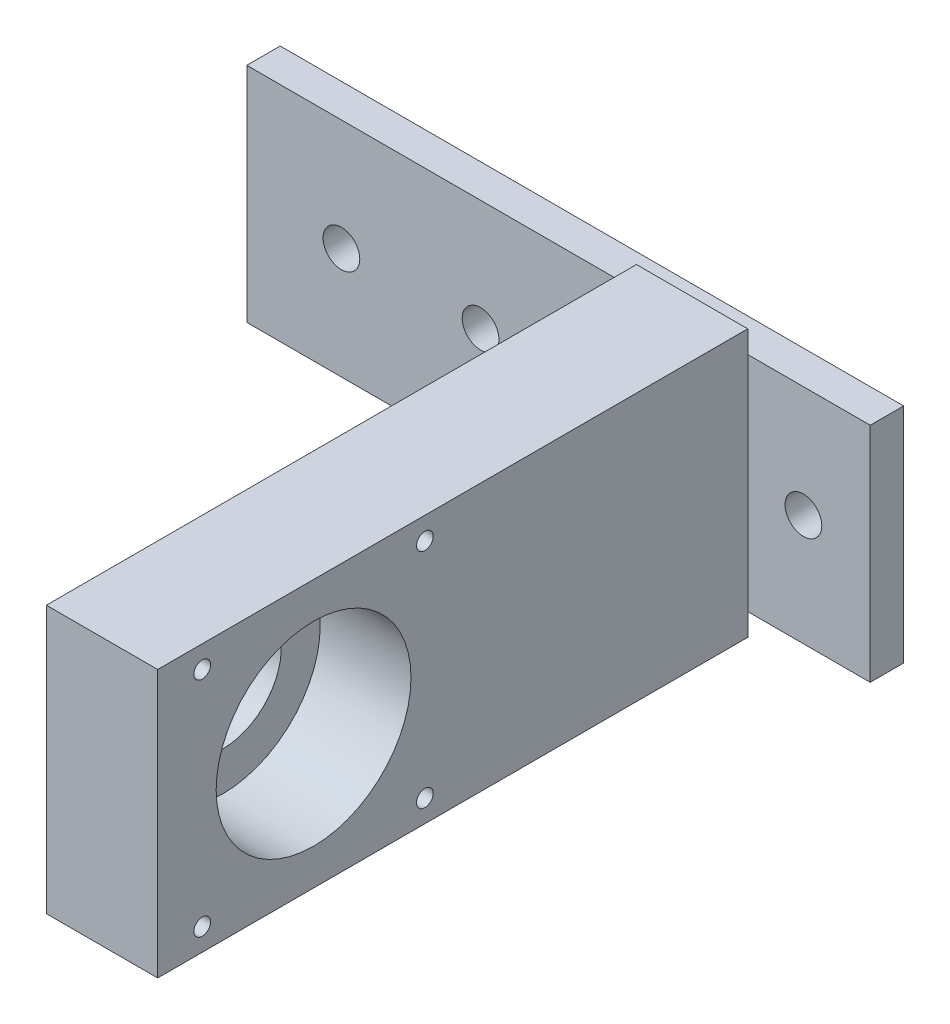
ISO-10303-21;
HEADER;
FILE_DESCRIPTION(('STEP AP214'),'2;1');
FILE_NAME('part.step','',(''),(''),'','','');
FILE_SCHEMA(('AUTOMOTIVE_DESIGN { 1 0 10303 214 1 1 1 1 }'));
ENDSEC;
DATA;
#1=APPLICATION_CONTEXT('core data for automotive mechanical design processes');
#2=APPLICATION_PROTOCOL_DEFINITION('international standard','automotive_design',2000,#1);
#3=PRODUCT_CONTEXT('',#1,'mechanical');
#4=PRODUCT('Part','Part','',(#3));
#5=PRODUCT_RELATED_PRODUCT_CATEGORY('part','',(#4));
#6=PRODUCT_DEFINITION_FORMATION('','',#4);
#7=PRODUCT_DEFINITION_CONTEXT('part definition',#1,'design');
#8=PRODUCT_DEFINITION('design','',#6,#7);
#9=PRODUCT_DEFINITION_SHAPE('','',#8);
#10=(LENGTH_UNIT() NAMED_UNIT(*) SI_UNIT(.MILLI.,.METRE.));
#11=(NAMED_UNIT(*) PLANE_ANGLE_UNIT() SI_UNIT($,.RADIAN.));
#12=(NAMED_UNIT(*) SI_UNIT($,.STERADIAN.) SOLID_ANGLE_UNIT());
#13=UNCERTAINTY_MEASURE_WITH_UNIT(LENGTH_MEASURE(1.E-05),#10,'distance_accuracy_value','');
#14=(GEOMETRIC_REPRESENTATION_CONTEXT(3) GLOBAL_UNCERTAINTY_ASSIGNED_CONTEXT((#13)) GLOBAL_UNIT_ASSIGNED_CONTEXT((#10,
#11,#12)) REPRESENTATION_CONTEXT('',''));
#15=CARTESIAN_POINT('',(0.,0.,0.));
#16=DIRECTION('',(0.,0.,1.));
#17=DIRECTION('',(1.,0.,0.));
#18=AXIS2_PLACEMENT_3D('',#15,#16,#17);
#19=CARTESIAN_POINT('',(100.,24.,0.002299999999991));
#20=DIRECTION('',(0.,0.,1.));
#21=DIRECTION('',(1.,0.,0.));
#22=AXIS2_PLACEMENT_3D('',#19,#20,#21);
#23=CYLINDRICAL_SURFACE('',#22,3.3);
#24=CARTESIAN_POINT('',(100.,24.,0.002299999999991));
#25=DIRECTION('',(0.,0.,1.));
#26=DIRECTION('',(1.,0.,0.));
#27=AXIS2_PLACEMENT_3D('',#24,#25,#26);
#28=CIRCLE('',#27,3.3);
#29=CARTESIAN_POINT('',(103.3,24.,0.002299999999991));
#30=VERTEX_POINT('',#29);
#31=EDGE_CURVE('E19',#30,#30,#28,.F.);
#32=ORIENTED_EDGE('',*,*,#31,.T.);
#33=EDGE_LOOP('',(#32));
#34=FACE_BOUND('',#33,.T.);
#35=CARTESIAN_POINT('',(100.,24.,6.0023));
#36=DIRECTION('',(0.,0.,1.));
#37=DIRECTION('',(1.,0.,0.));
#38=AXIS2_PLACEMENT_3D('',#35,#36,#37);
#39=CIRCLE('',#38,3.3);
#40=CARTESIAN_POINT('',(103.3,24.,6.0023));
#41=VERTEX_POINT('',#40);
#42=EDGE_CURVE('E133',#41,#41,#39,.F.);
#43=ORIENTED_EDGE('',*,*,#42,.F.);
#44=EDGE_LOOP('',(#43));
#45=FACE_BOUND('',#44,.T.);
#46=ADVANCED_FACE('F16',(#34,#45),#23,.F.);
#47=CARTESIAN_POINT('',(82.,44.,64.0023));
#48=DIRECTION('',(-1.,0.,0.));
#49=DIRECTION('',(0.,0.,1.));
#50=AXIS2_PLACEMENT_3D('',#47,#48,#49);
#51=PLANE('',#50);
#52=CARTESIAN_POINT('',(82.,44.,64.0023));
#53=DIRECTION('',(-1.,0.,0.));
#54=DIRECTION('',(0.,0.,1.));
#55=AXIS2_PLACEMENT_3D('',#52,#53,#54);
#56=CIRCLE('',#55,1.5);
#57=CARTESIAN_POINT('',(82.,44.,65.5023));
#58=VERTEX_POINT('',#57);
#59=EDGE_CURVE('E178',#58,#58,#56,.F.);
#60=ORIENTED_EDGE('',*,*,#59,.T.);
#61=EDGE_LOOP('',(#60));
#62=FACE_BOUND('',#61,.T.);
#63=ADVANCED_FACE('F186',(#62),#51,.F.);
#64=CARTESIAN_POINT('',(82.,44.,104.0023));
#65=DIRECTION('',(-1.,0.,0.));
#66=DIRECTION('',(0.,0.,1.));
#67=AXIS2_PLACEMENT_3D('',#64,#65,#66);
#68=PLANE('',#67);
#69=CARTESIAN_POINT('',(82.,44.,104.0023));
#70=DIRECTION('',(-1.,0.,0.));
#71=DIRECTION('',(0.,0.,1.));
#72=AXIS2_PLACEMENT_3D('',#69,#70,#71);
#73=CIRCLE('',#72,1.5);
#74=CARTESIAN_POINT('',(82.,44.,105.5023));
#75=VERTEX_POINT('',#74);
#76=EDGE_CURVE('E175',#75,#75,#73,.F.);
#77=ORIENTED_EDGE('',*,*,#76,.T.);
#78=EDGE_LOOP('',(#77));
#79=FACE_BOUND('',#78,.T.);
#80=ADVANCED_FACE('F192',(#79),#68,.F.);
#81=CARTESIAN_POINT('',(82.,4.,64.0023));
#82=DIRECTION('',(-1.,0.,0.));
#83=DIRECTION('',(0.,0.,1.));
#84=AXIS2_PLACEMENT_3D('',#81,#82,#83);
#85=PLANE('',#84);
#86=CARTESIAN_POINT('',(82.,4.,64.0023));
#87=DIRECTION('',(-1.,0.,0.));
#88=DIRECTION('',(0.,0.,1.));
#89=AXIS2_PLACEMENT_3D('',#86,#87,#88);
#90=CIRCLE('',#89,1.5);
#91=CARTESIAN_POINT('',(82.,4.,65.5023));
#92=VERTEX_POINT('',#91);
#93=EDGE_CURVE('E172',#92,#92,#90,.F.);
#94=ORIENTED_EDGE('',*,*,#93,.T.);
#95=EDGE_LOOP('',(#94));
#96=FACE_BOUND('',#95,.T.);
#97=ADVANCED_FACE('F286',(#96),#85,.F.);
#98=CARTESIAN_POINT('',(82.,4.,104.0023));
#99=DIRECTION('',(-1.,0.,0.));
#100=DIRECTION('',(0.,0.,1.));
#101=AXIS2_PLACEMENT_3D('',#98,#99,#100);
#102=PLANE('',#101);
#103=CARTESIAN_POINT('',(82.,4.,104.0023));
#104=DIRECTION('',(-1.,0.,0.));
#105=DIRECTION('',(0.,0.,1.));
#106=AXIS2_PLACEMENT_3D('',#103,#104,#105);
#107=CIRCLE('',#106,1.5);
#108=CARTESIAN_POINT('',(82.,4.,105.5023));
#109=VERTEX_POINT('',#108);
#110=EDGE_CURVE('E108',#109,#109,#107,.F.);
#111=ORIENTED_EDGE('',*,*,#110,.T.);
#112=EDGE_LOOP('',(#111));
#113=FACE_BOUND('',#112,.T.);
#114=ADVANCED_FACE('F282',(#113),#102,.F.);
#115=CARTESIAN_POINT('',(112.,4.,0.002299999999991));
#116=DIRECTION('',(-1.,0.,0.));
#117=DIRECTION('',(0.,0.,1.));
#118=AXIS2_PLACEMENT_3D('',#115,#116,#117);
#119=PLANE('',#118);
#120=DIRECTION('',(0.,1.,0.));
#121=VECTOR('',#120,1.);
#122=CARTESIAN_POINT('',(112.,4.,0.002299999999991));
#123=LINE('',#122,#121);
#124=CARTESIAN_POINT('',(112.,4.,0.002299999999991));
#125=VERTEX_POINT('',#124);
#126=CARTESIAN_POINT('',(112.,44.,0.002299999999991));
#127=VERTEX_POINT('',#126);
#128=EDGE_CURVE('E134',#125,#127,#123,.T.);
#129=ORIENTED_EDGE('',*,*,#128,.T.);
#130=DIRECTION('',(0.,0.,1.));
#131=VECTOR('',#130,1.);
#132=CARTESIAN_POINT('',(112.,44.,0.002299999999991));
#133=LINE('',#132,#131);
#134=CARTESIAN_POINT('',(112.,44.,6.0023));
#135=VERTEX_POINT('',#134);
#136=EDGE_CURVE('E120',#135,#127,#133,.F.);
#137=ORIENTED_EDGE('',*,*,#136,.F.);
#138=DIRECTION('',(0.,1.,0.));
#139=VECTOR('',#138,1.);
#140=CARTESIAN_POINT('',(112.,4.,6.0023));
#141=LINE('',#140,#139);
#142=CARTESIAN_POINT('',(112.,4.,6.0023));
#143=VERTEX_POINT('',#142);
#144=EDGE_CURVE('E90',#143,#135,#141,.T.);
#145=ORIENTED_EDGE('',*,*,#144,.F.);
#146=DIRECTION('',(0.,0.,1.));
#147=VECTOR('',#146,1.);
#148=CARTESIAN_POINT('',(112.,4.,0.002299999999991));
#149=LINE('',#148,#147);
#150=EDGE_CURVE('E471',#143,#125,#149,.F.);
#151=ORIENTED_EDGE('',*,*,#150,.T.);
#152=EDGE_LOOP('',(#129,#137,#145,#151));
#153=FACE_BOUND('',#152,.T.);
#154=ADVANCED_FACE('F278',(#153),#119,.F.);
#155=CARTESIAN_POINT('',(112.,4.,0.002299999999991));
#156=DIRECTION('',(0.,0.,1.));
#157=DIRECTION('',(1.,0.,0.));
#158=AXIS2_PLACEMENT_3D('',#155,#156,#157);
#159=PLANE('',#158);
#160=CARTESIAN_POINT('',(17.,24.,0.002299999999991));
#161=DIRECTION('',(0.,0.,1.));
#162=DIRECTION('',(1.,0.,0.));
#163=AXIS2_PLACEMENT_3D('',#160,#161,#162);
#164=CIRCLE('',#163,3.3);
#165=CARTESIAN_POINT('',(20.3,24.,0.002299999999991));
#166=VERTEX_POINT('',#165);
#167=EDGE_CURVE('E124',#166,#166,#164,.T.);
#168=ORIENTED_EDGE('',*,*,#167,.T.);
#169=EDGE_LOOP('',(#168));
#170=FACE_BOUND('',#169,.T.);
#171=CARTESIAN_POINT('',(42.,24.,0.002299999999991));
#172=DIRECTION('',(0.,0.,1.));
#173=DIRECTION('',(1.,0.,0.));
#174=AXIS2_PLACEMENT_3D('',#171,#172,#173);
#175=CIRCLE('',#174,3.3);
#176=CARTESIAN_POINT('',(45.3,24.,0.002299999999991));
#177=VERTEX_POINT('',#176);
#178=EDGE_CURVE('E121',#177,#177,#175,.T.);
#179=ORIENTED_EDGE('',*,*,#178,.T.);
#180=EDGE_LOOP('',(#179));
#181=FACE_BOUND('',#180,.T.);
#182=ORIENTED_EDGE('',*,*,#31,.F.);
#183=EDGE_LOOP('',(#182));
#184=FACE_BOUND('',#183,.T.);
#185=DIRECTION('',(1.,0.,0.));
#186=VECTOR('',#185,1.);
#187=CARTESIAN_POINT('',(112.,4.,0.002299999999991));
#188=LINE('',#187,#186);
#189=CARTESIAN_POINT('',(0.,4.,0.002299999999991));
#190=VERTEX_POINT('',#189);
#191=EDGE_CURVE('E104',#125,#190,#188,.F.);
#192=ORIENTED_EDGE('',*,*,#191,.T.);
#193=DIRECTION('',(0.,1.,0.));
#194=VECTOR('',#193,1.);
#195=CARTESIAN_POINT('',(0.,4.,0.002299999999991));
#196=LINE('',#195,#194);
#197=CARTESIAN_POINT('',(0.,44.,0.002299999999991));
#198=VERTEX_POINT('',#197);
#199=EDGE_CURVE('E96',#198,#190,#196,.F.);
#200=ORIENTED_EDGE('',*,*,#199,.F.);
#201=DIRECTION('',(1.,0.,0.));
#202=VECTOR('',#201,1.);
#203=CARTESIAN_POINT('',(112.,44.,0.002299999999991));
#204=LINE('',#203,#202);
#205=EDGE_CURVE('E101',#127,#198,#204,.F.);
#206=ORIENTED_EDGE('',*,*,#205,.F.);
#207=ORIENTED_EDGE('',*,*,#128,.F.);
#208=EDGE_LOOP('',(#192,#200,#206,#207));
#209=FACE_BOUND('',#208,.T.);
#210=ADVANCED_FACE('F98',(#170,#181,#184,#209),#159,.F.);
#211=CARTESIAN_POINT('',(112.,4.,6.0023));
#212=DIRECTION('',(0.,0.,1.));
#213=DIRECTION('',(1.,0.,0.));
#214=AXIS2_PLACEMENT_3D('',#211,#212,#213);
#215=PLANE('',#214);
#216=ORIENTED_EDGE('',*,*,#42,.T.);
#217=EDGE_LOOP('',(#216));
#218=FACE_BOUND('',#217,.T.);
#219=ORIENTED_EDGE('',*,*,#144,.T.);
#220=DIRECTION('',(1.,0.,0.));
#221=VECTOR('',#220,1.);
#222=CARTESIAN_POINT('',(112.,44.,6.0023));
#223=LINE('',#222,#221);
#224=CARTESIAN_POINT('',(90.,44.,6.0023));
#225=VERTEX_POINT('',#224);
#226=EDGE_CURVE('E116',#225,#135,#223,.T.);
#227=ORIENTED_EDGE('',*,*,#226,.F.);
#228=DIRECTION('',(0.,1.,0.));
#229=VECTOR('',#228,1.);
#230=CARTESIAN_POINT('',(90.,0.,6.0023));
#231=LINE('',#230,#229);
#232=CARTESIAN_POINT('',(90.,4.,6.0023));
#233=VERTEX_POINT('',#232);
#234=EDGE_CURVE('E167',#225,#233,#231,.F.);
#235=ORIENTED_EDGE('',*,*,#234,.T.);
#236=DIRECTION('',(1.,0.,0.));
#237=VECTOR('',#236,1.);
#238=CARTESIAN_POINT('',(112.,4.,6.0023));
#239=LINE('',#238,#237);
#240=EDGE_CURVE('E476',#233,#143,#239,.T.);
#241=ORIENTED_EDGE('',*,*,#240,.T.);
#242=EDGE_LOOP('',(#219,#227,#235,#241));
#243=FACE_BOUND('',#242,.T.);
#244=ADVANCED_FACE('F183',(#218,#243),#215,.T.);
#245=CARTESIAN_POINT('',(90.,44.,64.0023));
#246=DIRECTION('',(-1.,0.,0.));
#247=DIRECTION('',(0.,0.,1.));
#248=AXIS2_PLACEMENT_3D('',#245,#246,#247);
#249=CYLINDRICAL_SURFACE('',#248,1.5);
#250=CARTESIAN_POINT('',(90.,44.,64.0023));
#251=DIRECTION('',(-1.,0.,0.));
#252=DIRECTION('',(0.,0.,1.));
#253=AXIS2_PLACEMENT_3D('',#250,#251,#252);
#254=CIRCLE('',#253,1.5);
#255=CARTESIAN_POINT('',(90.,44.,65.5023));
#256=VERTEX_POINT('',#255);
#257=EDGE_CURVE('E164',#256,#256,#254,.F.);
#258=ORIENTED_EDGE('',*,*,#257,.T.);
#259=EDGE_LOOP('',(#258));
#260=FACE_BOUND('',#259,.T.);
#261=ORIENTED_EDGE('',*,*,#59,.F.);
#262=EDGE_LOOP('',(#261));
#263=FACE_BOUND('',#262,.T.);
#264=ADVANCED_FACE('F269',(#260,#263),#249,.F.);
#265=CARTESIAN_POINT('',(90.,44.,104.0023));
#266=DIRECTION('',(-1.,0.,0.));
#267=DIRECTION('',(0.,0.,1.));
#268=AXIS2_PLACEMENT_3D('',#265,#266,#267);
#269=CYLINDRICAL_SURFACE('',#268,1.5);
#270=CARTESIAN_POINT('',(90.,44.,104.0023));
#271=DIRECTION('',(-1.,0.,0.));
#272=DIRECTION('',(0.,0.,1.));
#273=AXIS2_PLACEMENT_3D('',#270,#271,#272);
#274=CIRCLE('',#273,1.5);
#275=CARTESIAN_POINT('',(90.,44.,105.5023));
#276=VERTEX_POINT('',#275);
#277=EDGE_CURVE('E161',#276,#276,#274,.F.);
#278=ORIENTED_EDGE('',*,*,#277,.T.);
#279=EDGE_LOOP('',(#278));
#280=FACE_BOUND('',#279,.T.);
#281=ORIENTED_EDGE('',*,*,#76,.F.);
#282=EDGE_LOOP('',(#281));
#283=FACE_BOUND('',#282,.T.);
#284=ADVANCED_FACE('F265',(#280,#283),#269,.F.);
#285=CARTESIAN_POINT('',(90.,4.,64.0023));
#286=DIRECTION('',(-1.,0.,0.));
#287=DIRECTION('',(0.,0.,1.));
#288=AXIS2_PLACEMENT_3D('',#285,#286,#287);
#289=CYLINDRICAL_SURFACE('',#288,1.5);
#290=CARTESIAN_POINT('',(90.,4.,64.0023));
#291=DIRECTION('',(-1.,0.,0.));
#292=DIRECTION('',(0.,0.,1.));
#293=AXIS2_PLACEMENT_3D('',#290,#291,#292);
#294=CIRCLE('',#293,1.5);
#295=CARTESIAN_POINT('',(90.,4.,65.5023));
#296=VERTEX_POINT('',#295);
#297=EDGE_CURVE('E158',#296,#296,#294,.F.);
#298=ORIENTED_EDGE('',*,*,#297,.T.);
#299=EDGE_LOOP('',(#298));
#300=FACE_BOUND('',#299,.T.);
#301=ORIENTED_EDGE('',*,*,#93,.F.);
#302=EDGE_LOOP('',(#301));
#303=FACE_BOUND('',#302,.T.);
#304=ADVANCED_FACE('F261',(#300,#303),#289,.F.);
#305=CARTESIAN_POINT('',(90.,4.,104.0023));
#306=DIRECTION('',(-1.,0.,0.));
#307=DIRECTION('',(0.,0.,1.));
#308=AXIS2_PLACEMENT_3D('',#305,#306,#307);
#309=CYLINDRICAL_SURFACE('',#308,1.5);
#310=CARTESIAN_POINT('',(90.,4.,104.0023));
#311=DIRECTION('',(-1.,0.,0.));
#312=DIRECTION('',(0.,0.,1.));
#313=AXIS2_PLACEMENT_3D('',#310,#311,#312);
#314=CIRCLE('',#313,1.5);
#315=CARTESIAN_POINT('',(90.,4.,105.5023));
#316=VERTEX_POINT('',#315);
#317=EDGE_CURVE('E152',#316,#316,#314,.F.);
#318=ORIENTED_EDGE('',*,*,#317,.T.);
#319=EDGE_LOOP('',(#318));
#320=FACE_BOUND('',#319,.T.);
#321=ORIENTED_EDGE('',*,*,#110,.F.);
#322=EDGE_LOOP('',(#321));
#323=FACE_BOUND('',#322,.T.);
#324=ADVANCED_FACE('F257',(#320,#323),#309,.F.);
#325=CARTESIAN_POINT('',(90.,24.,84.0023));
#326=DIRECTION('',(-1.,0.,0.));
#327=DIRECTION('',(0.,0.,1.));
#328=AXIS2_PLACEMENT_3D('',#325,#326,#327);
#329=CYLINDRICAL_SURFACE('',#328,17.5);
#330=CARTESIAN_POINT('',(90.,24.,84.0023));
#331=DIRECTION('',(-1.,0.,0.));
#332=DIRECTION('',(0.,0.,1.));
#333=AXIS2_PLACEMENT_3D('',#330,#331,#332);
#334=CIRCLE('',#333,17.5);
#335=CARTESIAN_POINT('',(90.,24.,101.5023));
#336=VERTEX_POINT('',#335);
#337=EDGE_CURVE('E155',#336,#336,#334,.F.);
#338=ORIENTED_EDGE('',*,*,#337,.T.);
#339=EDGE_LOOP('',(#338));
#340=FACE_BOUND('',#339,.T.);
#341=CARTESIAN_POINT('',(73.7,24.,84.0023));
#342=DIRECTION('',(-1.,0.,0.));
#343=DIRECTION('',(0.,0.,1.));
#344=AXIS2_PLACEMENT_3D('',#341,#342,#343);
#345=CIRCLE('',#344,17.5);
#346=CARTESIAN_POINT('',(73.7,24.,101.5023));
#347=VERTEX_POINT('',#346);
#348=EDGE_CURVE('E148',#347,#347,#345,.T.);
#349=ORIENTED_EDGE('',*,*,#348,.T.);
#350=EDGE_LOOP('',(#349));
#351=FACE_BOUND('',#350,.T.);
#352=ADVANCED_FACE('F254',(#340,#351),#329,.F.);
#353=CARTESIAN_POINT('',(0.,4.,0.002299999999991));
#354=DIRECTION('',(-1.,0.,0.));
#355=DIRECTION('',(0.,0.,1.));
#356=AXIS2_PLACEMENT_3D('',#353,#354,#355);
#357=PLANE('',#356);
#358=ORIENTED_EDGE('',*,*,#199,.T.);
#359=DIRECTION('',(0.,0.,1.));
#360=VECTOR('',#359,1.);
#361=CARTESIAN_POINT('',(0.,4.,0.002299999999991));
#362=LINE('',#361,#360);
#363=CARTESIAN_POINT('',(0.,4.,6.0023));
#364=VERTEX_POINT('',#363);
#365=EDGE_CURVE('E128',#190,#364,#362,.T.);
#366=ORIENTED_EDGE('',*,*,#365,.T.);
#367=DIRECTION('',(0.,1.,0.));
#368=VECTOR('',#367,1.);
#369=CARTESIAN_POINT('',(0.,4.,6.0023));
#370=LINE('',#369,#368);
#371=CARTESIAN_POINT('',(0.,44.,6.0023));
#372=VERTEX_POINT('',#371);
#373=EDGE_CURVE('E113',#372,#364,#370,.F.);
#374=ORIENTED_EDGE('',*,*,#373,.F.);
#375=DIRECTION('',(0.,0.,1.));
#376=VECTOR('',#375,1.);
#377=CARTESIAN_POINT('',(0.,44.,0.002299999999991));
#378=LINE('',#377,#376);
#379=EDGE_CURVE('E107',#198,#372,#378,.T.);
#380=ORIENTED_EDGE('',*,*,#379,.F.);
#381=EDGE_LOOP('',(#358,#366,#374,#380));
#382=FACE_BOUND('',#381,.T.);
#383=ADVANCED_FACE('F111',(#382),#357,.T.);
#384=CARTESIAN_POINT('',(112.,44.,0.002299999999991));
#385=DIRECTION('',(0.,1.,0.));
#386=DIRECTION('',(0.,0.,1.));
#387=AXIS2_PLACEMENT_3D('',#384,#385,#386);
#388=PLANE('',#387);
#389=ORIENTED_EDGE('',*,*,#136,.T.);
#390=ORIENTED_EDGE('',*,*,#205,.T.);
#391=ORIENTED_EDGE('',*,*,#379,.T.);
#392=DIRECTION('',(1.,0.,0.));
#393=VECTOR('',#392,1.);
#394=CARTESIAN_POINT('',(112.,44.,6.0023));
#395=LINE('',#394,#393);
#396=CARTESIAN_POINT('',(70.,44.,6.0023));
#397=VERTEX_POINT('',#396);
#398=EDGE_CURVE('E147',#397,#372,#395,.F.);
#399=ORIENTED_EDGE('',*,*,#398,.F.);
#400=DIRECTION('',(1.,0.,0.));
#401=VECTOR('',#400,1.);
#402=CARTESIAN_POINT('',(90.,44.,6.0023));
#403=LINE('',#402,#401);
#404=EDGE_CURVE('E488',#397,#225,#403,.T.);
#405=ORIENTED_EDGE('',*,*,#404,.T.);
#406=ORIENTED_EDGE('',*,*,#226,.T.);
#407=EDGE_LOOP('',(#389,#390,#391,#399,#405,#406));
#408=FACE_BOUND('',#407,.T.);
#409=ADVANCED_FACE('F118',(#408),#388,.T.);
#410=CARTESIAN_POINT('',(42.,24.,0.002299999999991));
#411=DIRECTION('',(0.,0.,1.));
#412=DIRECTION('',(1.,0.,0.));
#413=AXIS2_PLACEMENT_3D('',#410,#411,#412);
#414=CYLINDRICAL_SURFACE('',#413,3.3);
#415=ORIENTED_EDGE('',*,*,#178,.F.);
#416=EDGE_LOOP('',(#415));
#417=FACE_BOUND('',#416,.T.);
#418=CARTESIAN_POINT('',(42.,24.,6.0023));
#419=DIRECTION('',(0.,0.,1.));
#420=DIRECTION('',(1.,0.,0.));
#421=AXIS2_PLACEMENT_3D('',#418,#419,#420);
#422=CIRCLE('',#421,3.3);
#423=CARTESIAN_POINT('',(45.3,24.,6.0023));
#424=VERTEX_POINT('',#423);
#425=EDGE_CURVE('E144',#424,#424,#422,.F.);
#426=ORIENTED_EDGE('',*,*,#425,.F.);
#427=EDGE_LOOP('',(#426));
#428=FACE_BOUND('',#427,.T.);
#429=ADVANCED_FACE('F245',(#417,#428),#414,.F.);
#430=CARTESIAN_POINT('',(17.,24.,0.002299999999991));
#431=DIRECTION('',(0.,0.,1.));
#432=DIRECTION('',(1.,0.,0.));
#433=AXIS2_PLACEMENT_3D('',#430,#431,#432);
#434=CYLINDRICAL_SURFACE('',#433,3.3);
#435=ORIENTED_EDGE('',*,*,#167,.F.);
#436=EDGE_LOOP('',(#435));
#437=FACE_BOUND('',#436,.T.);
#438=CARTESIAN_POINT('',(17.,24.,6.0023));
#439=DIRECTION('',(0.,0.,1.));
#440=DIRECTION('',(1.,0.,0.));
#441=AXIS2_PLACEMENT_3D('',#438,#439,#440);
#442=CIRCLE('',#441,3.3);
#443=CARTESIAN_POINT('',(20.3,24.,6.0023));
#444=VERTEX_POINT('',#443);
#445=EDGE_CURVE('E140',#444,#444,#442,.F.);
#446=ORIENTED_EDGE('',*,*,#445,.F.);
#447=EDGE_LOOP('',(#446));
#448=FACE_BOUND('',#447,.T.);
#449=ADVANCED_FACE('F241',(#437,#448),#434,.F.);
#450=CARTESIAN_POINT('',(112.,4.,0.002299999999991));
#451=DIRECTION('',(0.,1.,0.));
#452=DIRECTION('',(0.,0.,1.));
#453=AXIS2_PLACEMENT_3D('',#450,#451,#452);
#454=PLANE('',#453);
#455=ORIENTED_EDGE('',*,*,#150,.F.);
#456=ORIENTED_EDGE('',*,*,#240,.F.);
#457=DIRECTION('',(1.,0.,0.));
#458=VECTOR('',#457,1.);
#459=CARTESIAN_POINT('',(90.,4.,6.0023));
#460=LINE('',#459,#458);
#461=CARTESIAN_POINT('',(70.,4.,6.0023));
#462=VERTEX_POINT('',#461);
#463=EDGE_CURVE('E143',#233,#462,#460,.F.);
#464=ORIENTED_EDGE('',*,*,#463,.T.);
#465=DIRECTION('',(1.,0.,0.));
#466=VECTOR('',#465,1.);
#467=CARTESIAN_POINT('',(112.,4.,6.0023));
#468=LINE('',#467,#466);
#469=EDGE_CURVE('E480',#364,#462,#468,.T.);
#470=ORIENTED_EDGE('',*,*,#469,.F.);
#471=ORIENTED_EDGE('',*,*,#365,.F.);
#472=ORIENTED_EDGE('',*,*,#191,.F.);
#473=EDGE_LOOP('',(#455,#456,#464,#470,#471,#472));
#474=FACE_BOUND('',#473,.T.);
#475=ADVANCED_FACE('F237',(#474),#454,.F.);
#476=CARTESIAN_POINT('',(90.,0.,6.0023));
#477=DIRECTION('',(-1.,0.,0.));
#478=DIRECTION('',(0.,0.,1.));
#479=AXIS2_PLACEMENT_3D('',#476,#477,#478);
#480=PLANE('',#479);
#481=ORIENTED_EDGE('',*,*,#317,.F.);
#482=EDGE_LOOP('',(#481));
#483=FACE_BOUND('',#482,.T.);
#484=ORIENTED_EDGE('',*,*,#337,.F.);
#485=EDGE_LOOP('',(#484));
#486=FACE_BOUND('',#485,.T.);
#487=ORIENTED_EDGE('',*,*,#297,.F.);
#488=EDGE_LOOP('',(#487));
#489=FACE_BOUND('',#488,.T.);
#490=ORIENTED_EDGE('',*,*,#277,.F.);
#491=EDGE_LOOP('',(#490));
#492=FACE_BOUND('',#491,.T.);
#493=ORIENTED_EDGE('',*,*,#257,.F.);
#494=EDGE_LOOP('',(#493));
#495=FACE_BOUND('',#494,.T.);
#496=DIRECTION('',(0.,1.,0.));
#497=VECTOR('',#496,1.);
#498=CARTESIAN_POINT('',(90.,0.,6.0023));
#499=LINE('',#498,#497);
#500=CARTESIAN_POINT('',(90.,0.,6.0023));
#501=VERTEX_POINT('',#500);
#502=EDGE_CURVE('E527',#501,#233,#499,.T.);
#503=ORIENTED_EDGE('',*,*,#502,.T.);
#504=ORIENTED_EDGE('',*,*,#234,.F.);
#505=DIRECTION('',(0.,1.,0.));
#506=VECTOR('',#505,1.);
#507=CARTESIAN_POINT('',(90.,0.,6.0023));
#508=LINE('',#507,#506);
#509=CARTESIAN_POINT('',(90.,48.,6.0023));
#510=VERTEX_POINT('',#509);
#511=EDGE_CURVE('E485',#225,#510,#508,.T.);
#512=ORIENTED_EDGE('',*,*,#511,.T.);
#513=DIRECTION('',(0.,0.,1.));
#514=VECTOR('',#513,1.);
#515=CARTESIAN_POINT('',(90.,48.,6.0023));
#516=LINE('',#515,#514);
#517=CARTESIAN_POINT('',(90.,48.,112.0023));
#518=VERTEX_POINT('',#517);
#519=EDGE_CURVE('E496',#518,#510,#516,.F.);
#520=ORIENTED_EDGE('',*,*,#519,.F.);
#521=DIRECTION('',(0.,1.,0.));
#522=VECTOR('',#521,1.);
#523=CARTESIAN_POINT('',(90.,0.,112.0023));
#524=LINE('',#523,#522);
#525=CARTESIAN_POINT('',(90.,0.,112.0023));
#526=VERTEX_POINT('',#525);
#527=EDGE_CURVE('E151',#526,#518,#524,.T.);
#528=ORIENTED_EDGE('',*,*,#527,.F.);
#529=DIRECTION('',(0.,0.,1.));
#530=VECTOR('',#529,1.);
#531=CARTESIAN_POINT('',(90.,0.,6.0023));
#532=LINE('',#531,#530);
#533=EDGE_CURVE('E524',#526,#501,#532,.F.);
#534=ORIENTED_EDGE('',*,*,#533,.T.);
#535=EDGE_LOOP('',(#503,#504,#512,#520,#528,#534));
#536=FACE_BOUND('',#535,.T.);
#537=ADVANCED_FACE('F233',(#483,#486,#489,#492,#495,#536),#480,.F.);
#538=CARTESIAN_POINT('',(73.7,24.,84.0023));
#539=DIRECTION('',(-1.,0.,0.));
#540=DIRECTION('',(0.,0.,1.));
#541=AXIS2_PLACEMENT_3D('',#538,#539,#540);
#542=PLANE('',#541);
#543=CARTESIAN_POINT('',(73.7,24.,84.0023));
#544=DIRECTION('',(-1.,0.,0.));
#545=DIRECTION('',(0.,0.,1.));
#546=AXIS2_PLACEMENT_3D('',#543,#544,#545);
#547=CIRCLE('',#546,10.5);
#548=CARTESIAN_POINT('',(73.7,24.,94.5023));
#549=VERTEX_POINT('',#548);
#550=EDGE_CURVE('E136',#549,#549,#547,.T.);
#551=ORIENTED_EDGE('',*,*,#550,.T.);
#552=EDGE_LOOP('',(#551));
#553=FACE_BOUND('',#552,.T.);
#554=ORIENTED_EDGE('',*,*,#348,.F.);
#555=EDGE_LOOP('',(#554));
#556=FACE_BOUND('',#555,.T.);
#557=ADVANCED_FACE('F229',(#553,#556),#542,.F.);
#558=CARTESIAN_POINT('',(90.,0.,112.0023));
#559=DIRECTION('',(0.,0.,1.));
#560=DIRECTION('',(1.,0.,0.));
#561=AXIS2_PLACEMENT_3D('',#558,#559,#560);
#562=PLANE('',#561);
#563=DIRECTION('',(1.,0.,0.));
#564=VECTOR('',#563,1.);
#565=CARTESIAN_POINT('',(90.,0.,112.0023));
#566=LINE('',#565,#564);
#567=CARTESIAN_POINT('',(70.,0.,112.0023));
#568=VERTEX_POINT('',#567);
#569=EDGE_CURVE('E504',#568,#526,#566,.T.);
#570=ORIENTED_EDGE('',*,*,#569,.T.);
#571=ORIENTED_EDGE('',*,*,#527,.T.);
#572=DIRECTION('',(1.,0.,0.));
#573=VECTOR('',#572,1.);
#574=CARTESIAN_POINT('',(90.,48.,112.0023));
#575=LINE('',#574,#573);
#576=CARTESIAN_POINT('',(70.,48.,112.0023));
#577=VERTEX_POINT('',#576);
#578=EDGE_CURVE('E498',#577,#518,#575,.T.);
#579=ORIENTED_EDGE('',*,*,#578,.F.);
#580=DIRECTION('',(0.,1.,0.));
#581=VECTOR('',#580,1.);
#582=CARTESIAN_POINT('',(70.,0.,112.0023));
#583=LINE('',#582,#581);
#584=EDGE_CURVE('E139',#568,#577,#583,.T.);
#585=ORIENTED_EDGE('',*,*,#584,.F.);
#586=EDGE_LOOP('',(#570,#571,#579,#585));
#587=FACE_BOUND('',#586,.T.);
#588=ADVANCED_FACE('F225',(#587),#562,.T.);
#589=CARTESIAN_POINT('',(90.,48.,6.0023));
#590=DIRECTION('',(0.,1.,0.));
#591=DIRECTION('',(0.,0.,1.));
#592=AXIS2_PLACEMENT_3D('',#589,#590,#591);
#593=PLANE('',#592);
#594=ORIENTED_EDGE('',*,*,#519,.T.);
#595=DIRECTION('',(1.,0.,0.));
#596=VECTOR('',#595,1.);
#597=CARTESIAN_POINT('',(90.,48.,6.0023));
#598=LINE('',#597,#596);
#599=CARTESIAN_POINT('',(70.,48.,6.0023));
#600=VERTEX_POINT('',#599);
#601=EDGE_CURVE('E494',#510,#600,#598,.F.);
#602=ORIENTED_EDGE('',*,*,#601,.T.);
#603=DIRECTION('',(0.,0.,1.));
#604=VECTOR('',#603,1.);
#605=CARTESIAN_POINT('',(70.,48.,6.0023));
#606=LINE('',#605,#604);
#607=EDGE_CURVE('E512',#577,#600,#606,.F.);
#608=ORIENTED_EDGE('',*,*,#607,.F.);
#609=ORIENTED_EDGE('',*,*,#578,.T.);
#610=EDGE_LOOP('',(#594,#602,#608,#609));
#611=FACE_BOUND('',#610,.T.);
#612=ADVANCED_FACE('F221',(#611),#593,.T.);
#613=CARTESIAN_POINT('',(90.,0.,6.0023));
#614=DIRECTION('',(0.,0.,1.));
#615=DIRECTION('',(1.,0.,0.));
#616=AXIS2_PLACEMENT_3D('',#613,#614,#615);
#617=PLANE('',#616);
#618=ORIENTED_EDGE('',*,*,#404,.F.);
#619=DIRECTION('',(0.,1.,0.));
#620=VECTOR('',#619,1.);
#621=CARTESIAN_POINT('',(70.,0.,6.0023));
#622=LINE('',#621,#620);
#623=EDGE_CURVE('E516',#600,#397,#622,.F.);
#624=ORIENTED_EDGE('',*,*,#623,.F.);
#625=ORIENTED_EDGE('',*,*,#601,.F.);
#626=ORIENTED_EDGE('',*,*,#511,.F.);
#627=EDGE_LOOP('',(#618,#624,#625,#626));
#628=FACE_BOUND('',#627,.T.);
#629=ADVANCED_FACE('F217',(#628),#617,.F.);
#630=CARTESIAN_POINT('',(112.,4.,6.0023));
#631=DIRECTION('',(0.,0.,1.));
#632=DIRECTION('',(1.,0.,0.));
#633=AXIS2_PLACEMENT_3D('',#630,#631,#632);
#634=PLANE('',#633);
#635=ORIENTED_EDGE('',*,*,#445,.T.);
#636=EDGE_LOOP('',(#635));
#637=FACE_BOUND('',#636,.T.);
#638=ORIENTED_EDGE('',*,*,#425,.T.);
#639=EDGE_LOOP('',(#638));
#640=FACE_BOUND('',#639,.T.);
#641=DIRECTION('',(0.,1.,0.));
#642=VECTOR('',#641,1.);
#643=CARTESIAN_POINT('',(70.,0.,6.0023));
#644=LINE('',#643,#642);
#645=EDGE_CURVE('E531',#397,#462,#644,.F.);
#646=ORIENTED_EDGE('',*,*,#645,.F.);
#647=ORIENTED_EDGE('',*,*,#398,.T.);
#648=ORIENTED_EDGE('',*,*,#373,.T.);
#649=ORIENTED_EDGE('',*,*,#469,.T.);
#650=EDGE_LOOP('',(#646,#647,#648,#649));
#651=FACE_BOUND('',#650,.T.);
#652=ADVANCED_FACE('F214',(#637,#640,#651),#634,.T.);
#653=CARTESIAN_POINT('',(90.,0.,6.0023));
#654=DIRECTION('',(0.,0.,1.));
#655=DIRECTION('',(1.,0.,0.));
#656=AXIS2_PLACEMENT_3D('',#653,#654,#655);
#657=PLANE('',#656);
#658=DIRECTION('',(1.,0.,0.));
#659=VECTOR('',#658,1.);
#660=CARTESIAN_POINT('',(90.,0.,6.0023));
#661=LINE('',#660,#659);
#662=CARTESIAN_POINT('',(70.,0.,6.0023));
#663=VERTEX_POINT('',#662);
#664=EDGE_CURVE('E34',#501,#663,#661,.F.);
#665=ORIENTED_EDGE('',*,*,#664,.T.);
#666=DIRECTION('',(0.,1.,0.));
#667=VECTOR('',#666,1.);
#668=CARTESIAN_POINT('',(70.,0.,6.0023));
#669=LINE('',#668,#667);
#670=EDGE_CURVE('E529',#462,#663,#669,.F.);
#671=ORIENTED_EDGE('',*,*,#670,.F.);
#672=ORIENTED_EDGE('',*,*,#463,.F.);
#673=ORIENTED_EDGE('',*,*,#502,.F.);
#674=EDGE_LOOP('',(#665,#671,#672,#673));
#675=FACE_BOUND('',#674,.T.);
#676=ADVANCED_FACE('F210',(#675),#657,.F.);
#677=CARTESIAN_POINT('',(90.,0.,6.0023));
#678=DIRECTION('',(0.,1.,0.));
#679=DIRECTION('',(0.,0.,1.));
#680=AXIS2_PLACEMENT_3D('',#677,#678,#679);
#681=PLANE('',#680);
#682=ORIENTED_EDGE('',*,*,#533,.F.);
#683=ORIENTED_EDGE('',*,*,#569,.F.);
#684=DIRECTION('',(0.,0.,1.));
#685=VECTOR('',#684,1.);
#686=CARTESIAN_POINT('',(70.,0.,6.0023));
#687=LINE('',#686,#685);
#688=EDGE_CURVE('E25',#663,#568,#687,.T.);
#689=ORIENTED_EDGE('',*,*,#688,.F.);
#690=ORIENTED_EDGE('',*,*,#664,.F.);
#691=EDGE_LOOP('',(#682,#683,#689,#690));
#692=FACE_BOUND('',#691,.T.);
#693=ADVANCED_FACE('F203',(#692),#681,.F.);
#694=CARTESIAN_POINT('',(90.,24.,84.0023));
#695=DIRECTION('',(-1.,0.,0.));
#696=DIRECTION('',(0.,0.,1.));
#697=AXIS2_PLACEMENT_3D('',#694,#695,#696);
#698=CYLINDRICAL_SURFACE('',#697,10.5);
#699=CARTESIAN_POINT('',(70.,24.,84.0023));
#700=DIRECTION('',(-1.,0.,0.));
#701=DIRECTION('',(0.,0.,1.));
#702=AXIS2_PLACEMENT_3D('',#699,#700,#701);
#703=CIRCLE('',#702,10.5);
#704=CARTESIAN_POINT('',(70.,24.,94.5023));
#705=VERTEX_POINT('',#704);
#706=EDGE_CURVE('E11',#705,#705,#703,.F.);
#707=ORIENTED_EDGE('',*,*,#706,.F.);
#708=EDGE_LOOP('',(#707));
#709=FACE_BOUND('',#708,.T.);
#710=ORIENTED_EDGE('',*,*,#550,.F.);
#711=EDGE_LOOP('',(#710));
#712=FACE_BOUND('',#711,.T.);
#713=ADVANCED_FACE('F197',(#709,#712),#698,.F.);
#714=CARTESIAN_POINT('',(70.,0.,6.0023));
#715=DIRECTION('',(-1.,0.,0.));
#716=DIRECTION('',(0.,0.,1.));
#717=AXIS2_PLACEMENT_3D('',#714,#715,#716);
#718=PLANE('',#717);
#719=ORIENTED_EDGE('',*,*,#706,.T.);
#720=EDGE_LOOP('',(#719));
#721=FACE_BOUND('',#720,.T.);
#722=ORIENTED_EDGE('',*,*,#670,.T.);
#723=ORIENTED_EDGE('',*,*,#688,.T.);
#724=ORIENTED_EDGE('',*,*,#584,.T.);
#725=ORIENTED_EDGE('',*,*,#607,.T.);
#726=ORIENTED_EDGE('',*,*,#623,.T.);
#727=ORIENTED_EDGE('',*,*,#645,.T.);
#728=EDGE_LOOP('',(#722,#723,#724,#725,#726,#727));
#729=FACE_BOUND('',#728,.T.);
#730=ADVANCED_FACE('F195',(#721,#729),#718,.T.);
#731=CLOSED_SHELL('',(#46,#63,#80,#97,#114,#154,#210,#244,#264,#284,#304,#324,#352,#383,#409,
#429,#449,#475,#537,#557,#588,#612,#629,#652,#676,#693,#713,#730));
#732=MANIFOLD_SOLID_BREP('B1',#731);
#733=ADVANCED_BREP_SHAPE_REPRESENTATION('',(#18,#732),#14);
#734=SHAPE_DEFINITION_REPRESENTATION(#9,#733);
ENDSEC;
END-ISO-10303-21;
